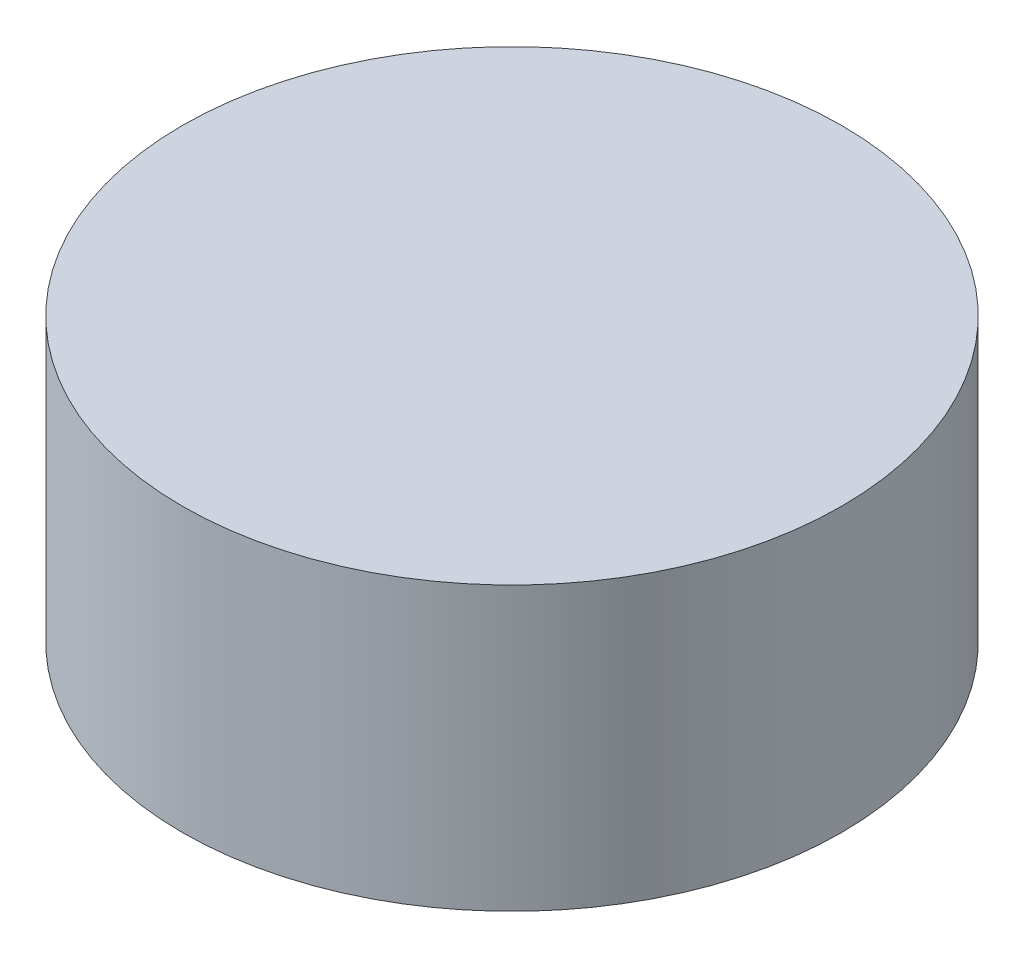
ISO-10303-21;
HEADER;
FILE_DESCRIPTION(('STEP AP214'),'2;1');
FILE_NAME('part.step','',(''),(''),'','','');
FILE_SCHEMA(('AUTOMOTIVE_DESIGN { 1 0 10303 214 1 1 1 1 }'));
ENDSEC;
DATA;
#1=APPLICATION_CONTEXT('core data for automotive mechanical design processes');
#2=APPLICATION_PROTOCOL_DEFINITION('international standard','automotive_design',2000,#1);
#3=PRODUCT_CONTEXT('',#1,'mechanical');
#4=PRODUCT('Part','Part','',(#3));
#5=PRODUCT_RELATED_PRODUCT_CATEGORY('part','',(#4));
#6=PRODUCT_DEFINITION_FORMATION('','',#4);
#7=PRODUCT_DEFINITION_CONTEXT('part definition',#1,'design');
#8=PRODUCT_DEFINITION('design','',#6,#7);
#9=PRODUCT_DEFINITION_SHAPE('','',#8);
#10=(LENGTH_UNIT() NAMED_UNIT(*) SI_UNIT(.MILLI.,.METRE.));
#11=(NAMED_UNIT(*) PLANE_ANGLE_UNIT() SI_UNIT($,.RADIAN.));
#12=(NAMED_UNIT(*) SI_UNIT($,.STERADIAN.) SOLID_ANGLE_UNIT());
#13=UNCERTAINTY_MEASURE_WITH_UNIT(LENGTH_MEASURE(1.E-05),#10,'distance_accuracy_value','');
#14=(GEOMETRIC_REPRESENTATION_CONTEXT(3) GLOBAL_UNCERTAINTY_ASSIGNED_CONTEXT((#13)) GLOBAL_UNIT_ASSIGNED_CONTEXT((#10,
#11,#12)) REPRESENTATION_CONTEXT('',''));
#15=CARTESIAN_POINT('',(0.,0.,0.));
#16=DIRECTION('',(0.,0.,1.));
#17=DIRECTION('',(1.,0.,0.));
#18=AXIS2_PLACEMENT_3D('',#15,#16,#17);
#19=CARTESIAN_POINT('',(0.,0.,0.));
#20=DIRECTION('',(0.,-1.,0.));
#21=DIRECTION('',(0.,0.,-1.));
#22=AXIS2_PLACEMENT_3D('',#19,#20,#21);
#23=PLANE('',#22);
#24=CARTESIAN_POINT('',(0.,0.,0.));
#25=DIRECTION('',(0.,-1.,0.));
#26=DIRECTION('',(0.,0.,-1.));
#27=AXIS2_PLACEMENT_3D('',#24,#25,#26);
#28=CIRCLE('',#27,3.5);
#29=CARTESIAN_POINT('',(0.,0.,-3.5));
#30=VERTEX_POINT('',#29);
#31=EDGE_CURVE('E10',#30,#30,#28,.T.);
#32=ORIENTED_EDGE('',*,*,#31,.T.);
#33=EDGE_LOOP('',(#32));
#34=FACE_BOUND('',#33,.T.);
#35=ADVANCED_FACE('F37',(#34),#23,.T.);
#36=CARTESIAN_POINT('',(0.,0.,0.));
#37=DIRECTION('',(0.,-1.,0.));
#38=DIRECTION('',(0.,0.,-1.));
#39=AXIS2_PLACEMENT_3D('',#36,#37,#38);
#40=CYLINDRICAL_SURFACE('',#39,3.5);
#41=CARTESIAN_POINT('',(0.,3.,0.));
#42=DIRECTION('',(0.,-1.,0.));
#43=DIRECTION('',(0.,0.,-1.));
#44=AXIS2_PLACEMENT_3D('',#41,#42,#43);
#45=CIRCLE('',#44,3.5);
#46=CARTESIAN_POINT('',(0.,3.,-3.5));
#47=VERTEX_POINT('',#46);
#48=EDGE_CURVE('E43',#47,#47,#45,.T.);
#49=ORIENTED_EDGE('',*,*,#48,.T.);
#50=EDGE_LOOP('',(#49));
#51=FACE_BOUND('',#50,.T.);
#52=ORIENTED_EDGE('',*,*,#31,.F.);
#53=EDGE_LOOP('',(#52));
#54=FACE_BOUND('',#53,.T.);
#55=ADVANCED_FACE('F49',(#51,#54),#40,.T.);
#56=CARTESIAN_POINT('',(3.5,3.,0.));
#57=DIRECTION('',(0.,1.,0.));
#58=DIRECTION('',(0.,0.,1.));
#59=AXIS2_PLACEMENT_3D('',#56,#57,#58);
#60=PLANE('',#59);
#61=ORIENTED_EDGE('',*,*,#48,.F.);
#62=EDGE_LOOP('',(#61));
#63=FACE_BOUND('',#62,.T.);
#64=ADVANCED_FACE('F52',(#63),#60,.T.);
#65=CLOSED_SHELL('',(#35,#55,#64));
#66=MANIFOLD_SOLID_BREP('B2',#65);
#67=ADVANCED_BREP_SHAPE_REPRESENTATION('',(#18,#66),#14);
#68=SHAPE_DEFINITION_REPRESENTATION(#9,#67);
ENDSEC;
END-ISO-10303-21;
